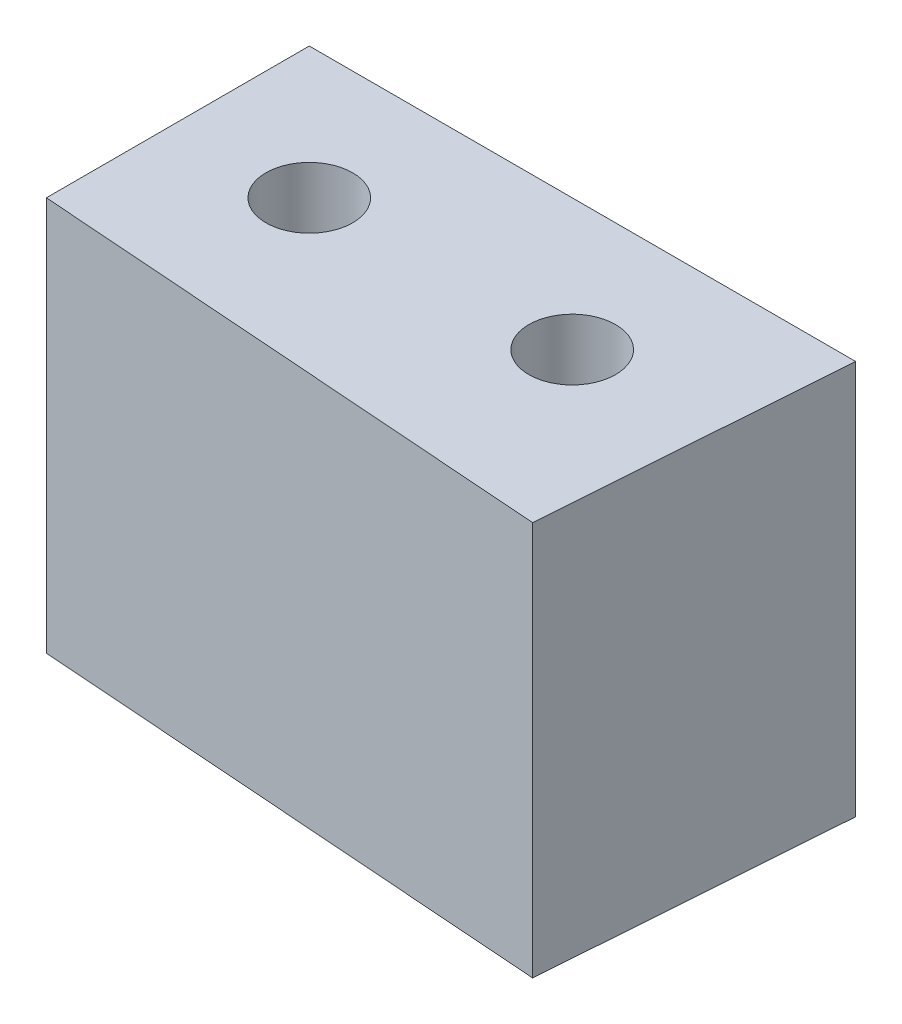
ISO-10303-21;
HEADER;
FILE_DESCRIPTION(('STEP AP214'),'2;1');
FILE_NAME('part.step','',(''),(''),'','','');
FILE_SCHEMA(('AUTOMOTIVE_DESIGN { 1 0 10303 214 1 1 1 1 }'));
ENDSEC;
DATA;
#1=APPLICATION_CONTEXT('core data for automotive mechanical design processes');
#2=APPLICATION_PROTOCOL_DEFINITION('international standard','automotive_design',2000,#1);
#3=PRODUCT_CONTEXT('',#1,'mechanical');
#4=PRODUCT('Part','Part','',(#3));
#5=PRODUCT_RELATED_PRODUCT_CATEGORY('part','',(#4));
#6=PRODUCT_DEFINITION_FORMATION('','',#4);
#7=PRODUCT_DEFINITION_CONTEXT('part definition',#1,'design');
#8=PRODUCT_DEFINITION('design','',#6,#7);
#9=PRODUCT_DEFINITION_SHAPE('','',#8);
#10=(LENGTH_UNIT() NAMED_UNIT(*) SI_UNIT(.MILLI.,.METRE.));
#11=(NAMED_UNIT(*) PLANE_ANGLE_UNIT() SI_UNIT($,.RADIAN.));
#12=(NAMED_UNIT(*) SI_UNIT($,.STERADIAN.) SOLID_ANGLE_UNIT());
#13=UNCERTAINTY_MEASURE_WITH_UNIT(LENGTH_MEASURE(1.E-05),#10,'distance_accuracy_value','');
#14=(GEOMETRIC_REPRESENTATION_CONTEXT(3) GLOBAL_UNCERTAINTY_ASSIGNED_CONTEXT((#13)) GLOBAL_UNIT_ASSIGNED_CONTEXT((#10,
#11,#12)) REPRESENTATION_CONTEXT('',''));
#15=CARTESIAN_POINT('',(0.,0.,0.));
#16=DIRECTION('',(0.,0.,1.));
#17=DIRECTION('',(1.,0.,0.));
#18=AXIS2_PLACEMENT_3D('',#15,#16,#17);
#19=CARTESIAN_POINT('',(0.,15.,0.));
#20=DIRECTION('',(0.,0.,1.));
#21=DIRECTION('',(1.,0.,0.));
#22=AXIS2_PLACEMENT_3D('',#19,#20,#21);
#23=PLANE('',#22);
#24=DIRECTION('',(-1.,0.,0.));
#25=VECTOR('',#24,1.);
#26=CARTESIAN_POINT('',(0.,0.,0.));
#27=LINE('',#26,#25);
#28=CARTESIAN_POINT('',(20.7810293969133,0.,0.));
#29=VERTEX_POINT('',#28);
#30=CARTESIAN_POINT('',(0.,0.,0.));
#31=VERTEX_POINT('',#30);
#32=EDGE_CURVE('E106',#29,#31,#27,.T.);
#33=ORIENTED_EDGE('',*,*,#32,.T.);
#34=DIRECTION('',(0.,-1.,0.));
#35=VECTOR('',#34,1.);
#36=CARTESIAN_POINT('',(0.,15.,0.));
#37=LINE('',#36,#35);
#38=CARTESIAN_POINT('',(0.,15.,0.));
#39=VERTEX_POINT('',#38);
#40=EDGE_CURVE('E11',#39,#31,#37,.T.);
#41=ORIENTED_EDGE('',*,*,#40,.F.);
#42=DIRECTION('',(-1.,0.,0.));
#43=VECTOR('',#42,1.);
#44=CARTESIAN_POINT('',(0.,15.,0.));
#45=LINE('',#44,#43);
#46=CARTESIAN_POINT('',(20.7810293969133,15.,0.));
#47=VERTEX_POINT('',#46);
#48=EDGE_CURVE('E94',#47,#39,#45,.T.);
#49=ORIENTED_EDGE('',*,*,#48,.F.);
#50=DIRECTION('',(0.,-1.,0.));
#51=VECTOR('',#50,1.);
#52=CARTESIAN_POINT('',(20.7810293969133,15.,0.));
#53=LINE('',#52,#51);
#54=EDGE_CURVE('E102',#47,#29,#53,.T.);
#55=ORIENTED_EDGE('',*,*,#54,.T.);
#56=EDGE_LOOP('',(#33,#41,#49,#55));
#57=FACE_BOUND('',#56,.T.);
#58=ADVANCED_FACE('F43',(#57),#23,.F.);
#59=CARTESIAN_POINT('',(0.,15.,0.));
#60=DIRECTION('',(1.,0.,0.));
#61=DIRECTION('',(0.,0.,-1.));
#62=AXIS2_PLACEMENT_3D('',#59,#60,#61);
#63=PLANE('',#62);
#64=DIRECTION('',(0.,0.,1.));
#65=VECTOR('',#64,1.);
#66=CARTESIAN_POINT('',(0.,0.,0.));
#67=LINE('',#66,#65);
#68=CARTESIAN_POINT('',(0.,0.,10.));
#69=VERTEX_POINT('',#68);
#70=EDGE_CURVE('E98',#31,#69,#67,.T.);
#71=ORIENTED_EDGE('',*,*,#70,.T.);
#72=DIRECTION('',(0.,-1.,0.));
#73=VECTOR('',#72,1.);
#74=CARTESIAN_POINT('',(0.,15.,10.));
#75=LINE('',#74,#73);
#76=CARTESIAN_POINT('',(0.,15.,10.));
#77=VERTEX_POINT('',#76);
#78=EDGE_CURVE('E51',#77,#69,#75,.T.);
#79=ORIENTED_EDGE('',*,*,#78,.F.);
#80=DIRECTION('',(0.,0.,1.));
#81=VECTOR('',#80,1.);
#82=CARTESIAN_POINT('',(0.,15.,0.));
#83=LINE('',#82,#81);
#84=EDGE_CURVE('E89',#39,#77,#83,.T.);
#85=ORIENTED_EDGE('',*,*,#84,.F.);
#86=ORIENTED_EDGE('',*,*,#40,.T.);
#87=EDGE_LOOP('',(#71,#79,#85,#86));
#88=FACE_BOUND('',#87,.T.);
#89=ADVANCED_FACE('F97',(#88),#63,.F.);
#90=CARTESIAN_POINT('',(0.,15.,10.));
#91=DIRECTION('',(0.0726166016281948,0.,-0.997359929598123));
#92=DIRECTION('',(-0.997359929598123,0.,-0.0726166016281948));
#93=AXIS2_PLACEMENT_3D('',#90,#91,#92);
#94=PLANE('',#93);
#95=DIRECTION('',(0.997359929598123,0.,0.0726166016281948));
#96=VECTOR('',#95,1.);
#97=CARTESIAN_POINT('',(0.,0.,10.));
#98=LINE('',#97,#96);
#99=CARTESIAN_POINT('',(19.9471985919625,0.,11.4523320325639));
#100=VERTEX_POINT('',#99);
#101=EDGE_CURVE('E76',#69,#100,#98,.T.);
#102=ORIENTED_EDGE('',*,*,#101,.T.);
#103=DIRECTION('',(0.,-1.,0.));
#104=VECTOR('',#103,1.);
#105=CARTESIAN_POINT('',(19.9471985919625,15.,11.4523320325639));
#106=LINE('',#105,#104);
#107=CARTESIAN_POINT('',(19.9471985919625,15.,11.4523320325639));
#108=VERTEX_POINT('',#107);
#109=EDGE_CURVE('E99',#108,#100,#106,.T.);
#110=ORIENTED_EDGE('',*,*,#109,.F.);
#111=DIRECTION('',(0.997359929598123,0.,0.0726166016281948));
#112=VECTOR('',#111,1.);
#113=CARTESIAN_POINT('',(0.,15.,10.));
#114=LINE('',#113,#112);
#115=EDGE_CURVE('E92',#77,#108,#114,.T.);
#116=ORIENTED_EDGE('',*,*,#115,.F.);
#117=ORIENTED_EDGE('',*,*,#78,.T.);
#118=EDGE_LOOP('',(#102,#110,#116,#117));
#119=FACE_BOUND('',#118,.T.);
#120=ADVANCED_FACE('F100',(#119),#94,.F.);
#121=CARTESIAN_POINT('',(19.9471985919625,15.,11.4523320325639));
#122=DIRECTION('',(-0.997359929598123,0.,-0.0726166016281949));
#123=DIRECTION('',(-0.0726166016281949,0.,0.997359929598123));
#124=AXIS2_PLACEMENT_3D('',#121,#122,#123);
#125=PLANE('',#124);
#126=DIRECTION('',(0.0726166016281949,0.,-0.997359929598123));
#127=VECTOR('',#126,1.);
#128=CARTESIAN_POINT('',(19.9471985919625,0.,11.4523320325639));
#129=LINE('',#128,#127);
#130=EDGE_CURVE('E82',#100,#29,#129,.T.);
#131=ORIENTED_EDGE('',*,*,#130,.T.);
#132=ORIENTED_EDGE('',*,*,#54,.F.);
#133=DIRECTION('',(0.0726166016281949,0.,-0.997359929598123));
#134=VECTOR('',#133,1.);
#135=CARTESIAN_POINT('',(19.9471985919625,15.,11.4523320325639));
#136=LINE('',#135,#134);
#137=EDGE_CURVE('E59',#108,#47,#136,.T.);
#138=ORIENTED_EDGE('',*,*,#137,.F.);
#139=ORIENTED_EDGE('',*,*,#109,.T.);
#140=EDGE_LOOP('',(#131,#132,#138,#139));
#141=FACE_BOUND('',#140,.T.);
#142=ADVANCED_FACE('F114',(#141),#125,.F.);
#143=CARTESIAN_POINT('',(0.,15.,0.));
#144=DIRECTION('',(0.,-1.,0.));
#145=DIRECTION('',(0.,0.,-1.));
#146=AXIS2_PLACEMENT_3D('',#143,#144,#145);
#147=PLANE('',#146);
#148=CARTESIAN_POINT('',(5.00000000000011,15.,5.000000000151));
#149=DIRECTION('',(0.,-1.,0.));
#150=DIRECTION('',(0.,0.,-1.));
#151=AXIS2_PLACEMENT_3D('',#148,#149,#150);
#152=CIRCLE('',#151,1.65);
#153=CARTESIAN_POINT('',(5.00000000000011,15.,3.350000000151));
#154=VERTEX_POINT('',#153);
#155=EDGE_CURVE('E109',#154,#154,#152,.T.);
#156=ORIENTED_EDGE('',*,*,#155,.T.);
#157=EDGE_LOOP('',(#156));
#158=FACE_BOUND('',#157,.T.);
#159=CARTESIAN_POINT('',(15.0000000000001,15.,5.000000000151));
#160=DIRECTION('',(0.,-1.,0.));
#161=DIRECTION('',(0.,0.,-1.));
#162=AXIS2_PLACEMENT_3D('',#159,#160,#161);
#163=CIRCLE('',#162,1.65);
#164=CARTESIAN_POINT('',(15.0000000000001,15.,3.350000000151));
#165=VERTEX_POINT('',#164);
#166=EDGE_CURVE('E120',#165,#165,#163,.T.);
#167=ORIENTED_EDGE('',*,*,#166,.T.);
#168=EDGE_LOOP('',(#167));
#169=FACE_BOUND('',#168,.T.);
#170=ORIENTED_EDGE('',*,*,#48,.T.);
#171=ORIENTED_EDGE('',*,*,#84,.T.);
#172=ORIENTED_EDGE('',*,*,#115,.T.);
#173=ORIENTED_EDGE('',*,*,#137,.T.);
#174=EDGE_LOOP('',(#170,#171,#172,#173));
#175=FACE_BOUND('',#174,.T.);
#176=ADVANCED_FACE('F90',(#158,#169,#175),#147,.F.);
#177=CARTESIAN_POINT('',(0.,0.,0.));
#178=DIRECTION('',(0.,-1.,0.));
#179=DIRECTION('',(0.,0.,-1.));
#180=AXIS2_PLACEMENT_3D('',#177,#178,#179);
#181=PLANE('',#180);
#182=CARTESIAN_POINT('',(5.00000000000011,0.,5.000000000151));
#183=DIRECTION('',(0.,-1.,0.));
#184=DIRECTION('',(0.,0.,-1.));
#185=AXIS2_PLACEMENT_3D('',#182,#183,#184);
#186=CIRCLE('',#185,1.65);
#187=CARTESIAN_POINT('',(5.00000000000011,0.,3.350000000151));
#188=VERTEX_POINT('',#187);
#189=EDGE_CURVE('E126',#188,#188,#186,.T.);
#190=ORIENTED_EDGE('',*,*,#189,.F.);
#191=EDGE_LOOP('',(#190));
#192=FACE_BOUND('',#191,.T.);
#193=CARTESIAN_POINT('',(15.0000000000001,0.,5.000000000151));
#194=DIRECTION('',(0.,-1.,0.));
#195=DIRECTION('',(0.,0.,-1.));
#196=AXIS2_PLACEMENT_3D('',#193,#194,#195);
#197=CIRCLE('',#196,1.65);
#198=CARTESIAN_POINT('',(15.0000000000001,0.,3.350000000151));
#199=VERTEX_POINT('',#198);
#200=EDGE_CURVE('E123',#199,#199,#197,.T.);
#201=ORIENTED_EDGE('',*,*,#200,.F.);
#202=EDGE_LOOP('',(#201));
#203=FACE_BOUND('',#202,.T.);
#204=ORIENTED_EDGE('',*,*,#32,.F.);
#205=ORIENTED_EDGE('',*,*,#130,.F.);
#206=ORIENTED_EDGE('',*,*,#101,.F.);
#207=ORIENTED_EDGE('',*,*,#70,.F.);
#208=EDGE_LOOP('',(#204,#205,#206,#207));
#209=FACE_BOUND('',#208,.T.);
#210=ADVANCED_FACE('F117',(#192,#203,#209),#181,.T.);
#211=CARTESIAN_POINT('',(15.0000000000001,15.,5.000000000151));
#212=DIRECTION('',(0.,-1.,0.));
#213=DIRECTION('',(0.,0.,-1.));
#214=AXIS2_PLACEMENT_3D('',#211,#212,#213);
#215=CYLINDRICAL_SURFACE('',#214,1.65);
#216=ORIENTED_EDGE('',*,*,#166,.F.);
#217=EDGE_LOOP('',(#216));
#218=FACE_BOUND('',#217,.T.);
#219=ORIENTED_EDGE('',*,*,#200,.T.);
#220=EDGE_LOOP('',(#219));
#221=FACE_BOUND('',#220,.T.);
#222=ADVANCED_FACE('F137',(#218,#221),#215,.F.);
#223=CARTESIAN_POINT('',(5.00000000000011,15.,5.000000000151));
#224=DIRECTION('',(0.,-1.,0.));
#225=DIRECTION('',(0.,0.,-1.));
#226=AXIS2_PLACEMENT_3D('',#223,#224,#225);
#227=CYLINDRICAL_SURFACE('',#226,1.65);
#228=ORIENTED_EDGE('',*,*,#155,.F.);
#229=EDGE_LOOP('',(#228));
#230=FACE_BOUND('',#229,.T.);
#231=ORIENTED_EDGE('',*,*,#189,.T.);
#232=EDGE_LOOP('',(#231));
#233=FACE_BOUND('',#232,.T.);
#234=ADVANCED_FACE('F134',(#230,#233),#227,.F.);
#235=CLOSED_SHELL('',(#58,#89,#120,#142,#176,#210,#222,#234));
#236=MANIFOLD_SOLID_BREP('B2',#235);
#237=ADVANCED_BREP_SHAPE_REPRESENTATION('',(#18,#236),#14);
#238=SHAPE_DEFINITION_REPRESENTATION(#9,#237);
ENDSEC;
END-ISO-10303-21;
